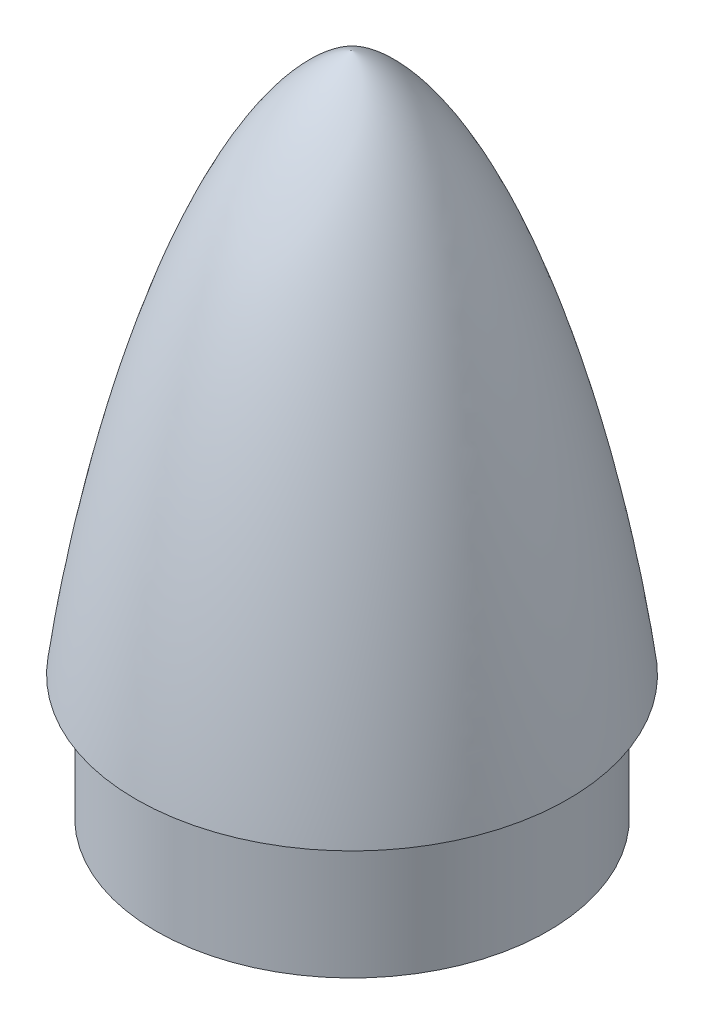
ISO-10303-21;
HEADER;
FILE_DESCRIPTION(('STEP AP214'),'2;1');
FILE_NAME('part.step','',(''),(''),'','','');
FILE_SCHEMA(('AUTOMOTIVE_DESIGN { 1 0 10303 214 1 1 1 1 }'));
ENDSEC;
DATA;
#1=APPLICATION_CONTEXT('core data for automotive mechanical design processes');
#2=APPLICATION_PROTOCOL_DEFINITION('international standard','automotive_design',2000,#1);
#3=PRODUCT_CONTEXT('',#1,'mechanical');
#4=PRODUCT('Part','Part','',(#3));
#5=PRODUCT_RELATED_PRODUCT_CATEGORY('part','',(#4));
#6=PRODUCT_DEFINITION_FORMATION('','',#4);
#7=PRODUCT_DEFINITION_CONTEXT('part definition',#1,'design');
#8=PRODUCT_DEFINITION('design','',#6,#7);
#9=PRODUCT_DEFINITION_SHAPE('','',#8);
#10=(LENGTH_UNIT() NAMED_UNIT(*) SI_UNIT(.MILLI.,.METRE.));
#11=(NAMED_UNIT(*) PLANE_ANGLE_UNIT() SI_UNIT($,.RADIAN.));
#12=(NAMED_UNIT(*) SI_UNIT($,.STERADIAN.) SOLID_ANGLE_UNIT());
#13=UNCERTAINTY_MEASURE_WITH_UNIT(LENGTH_MEASURE(1.E-05),#10,'distance_accuracy_value','');
#14=(GEOMETRIC_REPRESENTATION_CONTEXT(3) GLOBAL_UNCERTAINTY_ASSIGNED_CONTEXT((#13)) GLOBAL_UNIT_ASSIGNED_CONTEXT((#10,
#11,#12)) REPRESENTATION_CONTEXT('',''));
#15=CARTESIAN_POINT('',(0.,0.,0.));
#16=DIRECTION('',(0.,0.,1.));
#17=DIRECTION('',(1.,0.,0.));
#18=AXIS2_PLACEMENT_3D('',#15,#16,#17);
#19=CARTESIAN_POINT('',(0.,665.750960604012,0.));
#20=DIRECTION('',(0.,-1.,0.));
#21=DIRECTION('',(0.,0.,-1.));
#22=AXIS2_PLACEMENT_3D('',#19,#20,#21);
#23=PLANE('',#22);
#24=CARTESIAN_POINT('',(0.,665.750960604012,0.));
#25=DIRECTION('',(0.,-1.,0.));
#26=DIRECTION('',(0.,0.,-1.));
#27=AXIS2_PLACEMENT_3D('',#24,#25,#26);
#28=CIRCLE('',#27,39.9873740495648);
#29=CARTESIAN_POINT('',(0.,665.750960604012,-39.9873740495648));
#30=VERTEX_POINT('',#29);
#31=EDGE_CURVE('E11',#30,#30,#28,.T.);
#32=ORIENTED_EDGE('',*,*,#31,.F.);
#33=EDGE_LOOP('',(#32));
#34=FACE_BOUND('',#33,.T.);
#35=CARTESIAN_POINT('',(0.,665.750960604012,0.));
#36=DIRECTION('',(0.,-1.,0.));
#37=DIRECTION('',(0.,0.,-1.));
#38=AXIS2_PLACEMENT_3D('',#35,#36,#37);
#39=CIRCLE('',#38,29.21);
#40=CARTESIAN_POINT('',(0.,665.750960604012,-29.21));
#41=VERTEX_POINT('',#40);
#42=EDGE_CURVE('E62',#41,#41,#39,.T.);
#43=ORIENTED_EDGE('',*,*,#42,.T.);
#44=EDGE_LOOP('',(#43));
#45=FACE_BOUND('',#44,.T.);
#46=ADVANCED_FACE('F39',(#34,#45),#23,.F.);
#47=CARTESIAN_POINT('',(0.,663.718960603971,40.275));
#48=CARTESIAN_POINT('',(0.,688.907583193282,36.7573805419026));
#49=CARTESIAN_POINT('',(0.,724.997786955995,29.1140853739495));
#50=CARTESIAN_POINT('',(0.,760.035001988063,11.2991744389304));
#51=CARTESIAN_POINT('',(0.,766.,0.));
#52=B_SPLINE_CURVE_WITH_KNOTS('',3,(#47,#48,#49,#50,#51),.UNSPECIFIED.,.F.,.F.,(4,1,4),(0.,
0.671212939946486,1.),.UNSPECIFIED.);
#53=CARTESIAN_POINT('',(0.,663.718960603971,0.));
#54=DIRECTION('',(0.,-1.,0.));
#55=AXIS1_PLACEMENT('',#53,#54);
#56=SURFACE_OF_REVOLUTION('',#52,#55);
#57=CARTESIAN_POINT('',(0.,766.,0.));
#58=VERTEX_POINT('',#57);
#59=VERTEX_LOOP('',#58);
#60=FACE_BOUND('',#59,.T.);
#61=ORIENTED_EDGE('',*,*,#31,.T.);
#62=EDGE_LOOP('',(#61));
#63=FACE_BOUND('',#62,.T.);
#64=ADVANCED_FACE('F52',(#60,#63),#56,.T.);
#65=CARTESIAN_POINT('',(0.,663.718960603971,41.275));
#66=CARTESIAN_POINT('',(0.,696.102091455132,37.1149502985943));
#67=CARTESIAN_POINT('',(0.,738.275414141394,27.1862532536225));
#68=CARTESIAN_POINT('',(0.,762.00972802985,13.4751954296138));
#69=CARTESIAN_POINT('',(0.,767.,0.));
#70=B_SPLINE_CURVE_WITH_KNOTS('',4,(#65,#66,#67,#68,#69),.UNSPECIFIED.,.F.,.F.,(5,5),(0.,1.),.UNSPECIFIED.);
#71=CARTESIAN_POINT('',(0.,663.718960603971,0.));
#72=DIRECTION('',(0.,-1.,0.));
#73=AXIS1_PLACEMENT('',#71,#72);
#74=SURFACE_OF_REVOLUTION('',#70,#73);
#75=CARTESIAN_POINT('',(0.,767.,0.));
#76=VERTEX_POINT('',#75);
#77=VERTEX_LOOP('',#76);
#78=FACE_BOUND('',#77,.T.);
#79=CARTESIAN_POINT('',(0.,663.718960603971,0.));
#80=DIRECTION('',(0.,-1.,0.));
#81=DIRECTION('',(0.,0.,-1.));
#82=AXIS2_PLACEMENT_3D('',#79,#80,#81);
#83=CIRCLE('',#82,41.275);
#84=CARTESIAN_POINT('',(0.,663.718960603971,-41.275));
#85=VERTEX_POINT('',#84);
#86=EDGE_CURVE('E46',#85,#85,#83,.T.);
#87=ORIENTED_EDGE('',*,*,#86,.F.);
#88=EDGE_LOOP('',(#87));
#89=FACE_BOUND('',#88,.T.);
#90=ADVANCED_FACE('F55',(#78,#89),#74,.F.);
#91=CARTESIAN_POINT('',(0.,663.718960603971,0.));
#92=DIRECTION('',(0.,-1.,0.));
#93=DIRECTION('',(0.,0.,-1.));
#94=AXIS2_PLACEMENT_3D('',#91,#92,#93);
#95=PLANE('',#94);
#96=ORIENTED_EDGE('',*,*,#86,.T.);
#97=EDGE_LOOP('',(#96));
#98=FACE_BOUND('',#97,.T.);
#99=CARTESIAN_POINT('',(0.,663.718960603971,0.));
#100=DIRECTION('',(0.,-1.,0.));
#101=DIRECTION('',(0.,0.,-1.));
#102=AXIS2_PLACEMENT_3D('',#99,#100,#101);
#103=CIRCLE('',#102,37.465);
#104=CARTESIAN_POINT('',(0.,663.718960603971,-37.465));
#105=VERTEX_POINT('',#104);
#106=EDGE_CURVE('E83',#105,#105,#103,.T.);
#107=ORIENTED_EDGE('',*,*,#106,.F.);
#108=EDGE_LOOP('',(#107));
#109=FACE_BOUND('',#108,.T.);
#110=ADVANCED_FACE('F88',(#98,#109),#95,.T.);
#111=CARTESIAN_POINT('',(0.,663.718960603971,0.));
#112=DIRECTION('',(0.,-1.,0.));
#113=DIRECTION('',(0.,0.,-1.));
#114=AXIS2_PLACEMENT_3D('',#111,#112,#113);
#115=CYLINDRICAL_SURFACE('',#114,37.465);
#116=CARTESIAN_POINT('',(0.,640.,0.));
#117=DIRECTION('',(0.,-1.,0.));
#118=DIRECTION('',(0.,0.,-1.));
#119=AXIS2_PLACEMENT_3D('',#116,#117,#118);
#120=CIRCLE('',#119,37.465);
#121=CARTESIAN_POINT('',(0.,640.,-37.465));
#122=VERTEX_POINT('',#121);
#123=EDGE_CURVE('E80',#122,#122,#120,.T.);
#124=ORIENTED_EDGE('',*,*,#123,.F.);
#125=EDGE_LOOP('',(#124));
#126=FACE_BOUND('',#125,.T.);
#127=ORIENTED_EDGE('',*,*,#106,.T.);
#128=EDGE_LOOP('',(#127));
#129=FACE_BOUND('',#128,.T.);
#130=ADVANCED_FACE('F96',(#126,#129),#115,.T.);
#131=CARTESIAN_POINT('',(0.,640.,0.));
#132=DIRECTION('',(0.,-1.,0.));
#133=DIRECTION('',(0.,0.,-1.));
#134=AXIS2_PLACEMENT_3D('',#131,#132,#133);
#135=PLANE('',#134);
#136=ORIENTED_EDGE('',*,*,#123,.T.);
#137=EDGE_LOOP('',(#136));
#138=FACE_BOUND('',#137,.T.);
#139=CARTESIAN_POINT('',(0.,640.,0.));
#140=DIRECTION('',(0.,-1.,0.));
#141=DIRECTION('',(0.,0.,-1.));
#142=AXIS2_PLACEMENT_3D('',#139,#140,#141);
#143=CIRCLE('',#142,35.56);
#144=CARTESIAN_POINT('',(0.,640.,-35.56));
#145=VERTEX_POINT('',#144);
#146=EDGE_CURVE('E77',#145,#145,#143,.T.);
#147=ORIENTED_EDGE('',*,*,#146,.F.);
#148=EDGE_LOOP('',(#147));
#149=FACE_BOUND('',#148,.T.);
#150=ADVANCED_FACE('F107',(#138,#149),#135,.T.);
#151=CARTESIAN_POINT('',(0.,663.718960603971,0.));
#152=DIRECTION('',(0.,-1.,0.));
#153=DIRECTION('',(0.,0.,-1.));
#154=AXIS2_PLACEMENT_3D('',#151,#152,#153);
#155=CYLINDRICAL_SURFACE('',#154,35.56);
#156=ORIENTED_EDGE('',*,*,#146,.T.);
#157=EDGE_LOOP('',(#156));
#158=FACE_BOUND('',#157,.T.);
#159=CARTESIAN_POINT('',(0.,663.718960603971,0.));
#160=DIRECTION('',(0.,-1.,0.));
#161=DIRECTION('',(0.,0.,-1.));
#162=AXIS2_PLACEMENT_3D('',#159,#160,#161);
#163=CIRCLE('',#162,35.56);
#164=CARTESIAN_POINT('',(0.,663.718960603971,-35.56));
#165=VERTEX_POINT('',#164);
#166=EDGE_CURVE('E67',#165,#165,#163,.T.);
#167=ORIENTED_EDGE('',*,*,#166,.F.);
#168=EDGE_LOOP('',(#167));
#169=FACE_BOUND('',#168,.T.);
#170=ADVANCED_FACE('F111',(#158,#169),#155,.F.);
#171=CARTESIAN_POINT('',(0.,663.718960603971,0.));
#172=DIRECTION('',(0.,1.,0.));
#173=DIRECTION('',(0.,0.,1.));
#174=AXIS2_PLACEMENT_3D('',#171,#172,#173);
#175=PLANE('',#174);
#176=CARTESIAN_POINT('',(0.,663.718960603971,0.));
#177=DIRECTION('',(0.,-1.,0.));
#178=DIRECTION('',(0.,0.,-1.));
#179=AXIS2_PLACEMENT_3D('',#176,#177,#178);
#180=CIRCLE('',#179,29.21);
#181=CARTESIAN_POINT('',(0.,663.718960603971,-29.21));
#182=VERTEX_POINT('',#181);
#183=EDGE_CURVE('E64',#182,#182,#180,.T.);
#184=ORIENTED_EDGE('',*,*,#183,.F.);
#185=EDGE_LOOP('',(#184));
#186=FACE_BOUND('',#185,.T.);
#187=ORIENTED_EDGE('',*,*,#166,.T.);
#188=EDGE_LOOP('',(#187));
#189=FACE_BOUND('',#188,.T.);
#190=ADVANCED_FACE('F115',(#186,#189),#175,.F.);
#191=CARTESIAN_POINT('',(0.,663.718960603971,0.));
#192=DIRECTION('',(0.,-1.,0.));
#193=DIRECTION('',(0.,0.,-1.));
#194=AXIS2_PLACEMENT_3D('',#191,#192,#193);
#195=CYLINDRICAL_SURFACE('',#194,29.21);
#196=ORIENTED_EDGE('',*,*,#42,.F.);
#197=EDGE_LOOP('',(#196));
#198=FACE_BOUND('',#197,.T.);
#199=ORIENTED_EDGE('',*,*,#183,.T.);
#200=EDGE_LOOP('',(#199));
#201=FACE_BOUND('',#200,.T.);
#202=ADVANCED_FACE('F119',(#198,#201),#195,.F.);
#203=CLOSED_SHELL('',(#46,#64,#90,#110,#130,#150,#170,#190,#202));
#204=MANIFOLD_SOLID_BREP('B2',#203);
#205=ADVANCED_BREP_SHAPE_REPRESENTATION('',(#18,#204),#14);
#206=SHAPE_DEFINITION_REPRESENTATION(#9,#205);
ENDSEC;
END-ISO-10303-21;
